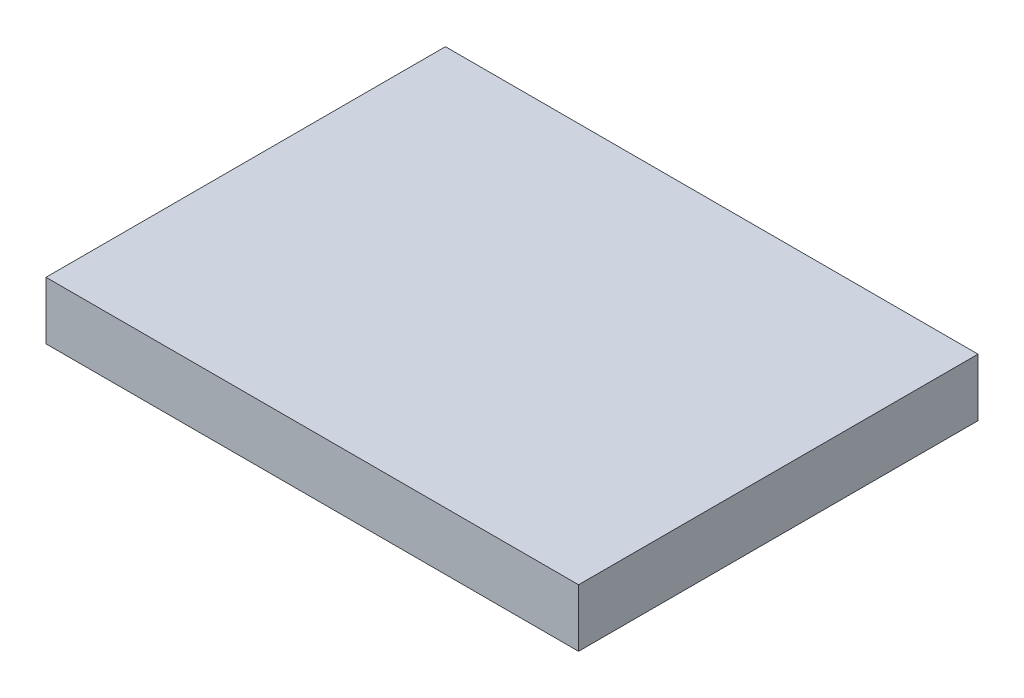
ISO-10303-21;
HEADER;
FILE_DESCRIPTION(('STEP AP214'),'2;1');
FILE_NAME('part.step','',(''),(''),'','','');
FILE_SCHEMA(('AUTOMOTIVE_DESIGN { 1 0 10303 214 1 1 1 1 }'));
ENDSEC;
DATA;
#1=APPLICATION_CONTEXT('core data for automotive mechanical design processes');
#2=APPLICATION_PROTOCOL_DEFINITION('international standard','automotive_design',2000,#1);
#3=PRODUCT_CONTEXT('',#1,'mechanical');
#4=PRODUCT('Part','Part','',(#3));
#5=PRODUCT_RELATED_PRODUCT_CATEGORY('part','',(#4));
#6=PRODUCT_DEFINITION_FORMATION('','',#4);
#7=PRODUCT_DEFINITION_CONTEXT('part definition',#1,'design');
#8=PRODUCT_DEFINITION('design','',#6,#7);
#9=PRODUCT_DEFINITION_SHAPE('','',#8);
#10=(LENGTH_UNIT() NAMED_UNIT(*) SI_UNIT(.MILLI.,.METRE.));
#11=(NAMED_UNIT(*) PLANE_ANGLE_UNIT() SI_UNIT($,.RADIAN.));
#12=(NAMED_UNIT(*) SI_UNIT($,.STERADIAN.) SOLID_ANGLE_UNIT());
#13=UNCERTAINTY_MEASURE_WITH_UNIT(LENGTH_MEASURE(1.E-05),#10,'distance_accuracy_value','');
#14=(GEOMETRIC_REPRESENTATION_CONTEXT(3) GLOBAL_UNCERTAINTY_ASSIGNED_CONTEXT((#13)) GLOBAL_UNIT_ASSIGNED_CONTEXT((#10,
#11,#12)) REPRESENTATION_CONTEXT('',''));
#15=CARTESIAN_POINT('',(0.,0.,0.));
#16=DIRECTION('',(0.,0.,1.));
#17=DIRECTION('',(1.,0.,0.));
#18=AXIS2_PLACEMENT_3D('',#15,#16,#17);
#19=CARTESIAN_POINT('',(0.,4.4,0.));
#20=DIRECTION('',(1.,0.,0.));
#21=DIRECTION('',(0.,0.,-1.));
#22=AXIS2_PLACEMENT_3D('',#19,#20,#21);
#23=PLANE('',#22);
#24=DIRECTION('',(0.,0.,1.));
#25=VECTOR('',#24,1.);
#26=CARTESIAN_POINT('',(0.,0.,0.));
#27=LINE('',#26,#25);
#28=CARTESIAN_POINT('',(0.,0.,-30.48));
#29=VERTEX_POINT('',#28);
#30=CARTESIAN_POINT('',(0.,0.,0.));
#31=VERTEX_POINT('',#30);
#32=EDGE_CURVE('E96',#29,#31,#27,.T.);
#33=ORIENTED_EDGE('',*,*,#32,.T.);
#34=DIRECTION('',(0.,-1.,0.));
#35=VECTOR('',#34,1.);
#36=CARTESIAN_POINT('',(0.,4.4,0.));
#37=LINE('',#36,#35);
#38=CARTESIAN_POINT('',(0.,4.4,0.));
#39=VERTEX_POINT('',#38);
#40=EDGE_CURVE('E11',#39,#31,#37,.T.);
#41=ORIENTED_EDGE('',*,*,#40,.F.);
#42=DIRECTION('',(0.,0.,1.));
#43=VECTOR('',#42,1.);
#44=CARTESIAN_POINT('',(0.,4.4,0.));
#45=LINE('',#44,#43);
#46=CARTESIAN_POINT('',(0.,4.4,-30.48));
#47=VERTEX_POINT('',#46);
#48=EDGE_CURVE('E84',#47,#39,#45,.T.);
#49=ORIENTED_EDGE('',*,*,#48,.F.);
#50=DIRECTION('',(0.,-1.,0.));
#51=VECTOR('',#50,1.);
#52=CARTESIAN_POINT('',(0.,4.4,-30.48));
#53=LINE('',#52,#51);
#54=EDGE_CURVE('E92',#47,#29,#53,.T.);
#55=ORIENTED_EDGE('',*,*,#54,.T.);
#56=EDGE_LOOP('',(#33,#41,#49,#55));
#57=FACE_BOUND('',#56,.T.);
#58=ADVANCED_FACE('F33',(#57),#23,.F.);
#59=CARTESIAN_POINT('',(0.,4.4,0.));
#60=DIRECTION('',(0.,0.,-1.));
#61=DIRECTION('',(-1.,0.,0.));
#62=AXIS2_PLACEMENT_3D('',#59,#60,#61);
#63=PLANE('',#62);
#64=DIRECTION('',(1.,0.,0.));
#65=VECTOR('',#64,1.);
#66=CARTESIAN_POINT('',(0.,0.,0.));
#67=LINE('',#66,#65);
#68=CARTESIAN_POINT('',(40.64,0.,0.));
#69=VERTEX_POINT('',#68);
#70=EDGE_CURVE('E88',#31,#69,#67,.T.);
#71=ORIENTED_EDGE('',*,*,#70,.T.);
#72=DIRECTION('',(0.,-1.,0.));
#73=VECTOR('',#72,1.);
#74=CARTESIAN_POINT('',(40.64,4.4,0.));
#75=LINE('',#74,#73);
#76=CARTESIAN_POINT('',(40.64,4.4,0.));
#77=VERTEX_POINT('',#76);
#78=EDGE_CURVE('E41',#77,#69,#75,.T.);
#79=ORIENTED_EDGE('',*,*,#78,.F.);
#80=DIRECTION('',(1.,0.,0.));
#81=VECTOR('',#80,1.);
#82=CARTESIAN_POINT('',(0.,4.4,0.));
#83=LINE('',#82,#81);
#84=EDGE_CURVE('E79',#39,#77,#83,.T.);
#85=ORIENTED_EDGE('',*,*,#84,.F.);
#86=ORIENTED_EDGE('',*,*,#40,.T.);
#87=EDGE_LOOP('',(#71,#79,#85,#86));
#88=FACE_BOUND('',#87,.T.);
#89=ADVANCED_FACE('F87',(#88),#63,.F.);
#90=CARTESIAN_POINT('',(40.64,4.4,0.));
#91=DIRECTION('',(-1.,0.,0.));
#92=DIRECTION('',(0.,0.,1.));
#93=AXIS2_PLACEMENT_3D('',#90,#91,#92);
#94=PLANE('',#93);
#95=DIRECTION('',(0.,0.,-1.));
#96=VECTOR('',#95,1.);
#97=CARTESIAN_POINT('',(40.64,0.,0.));
#98=LINE('',#97,#96);
#99=CARTESIAN_POINT('',(40.64,0.,-30.48));
#100=VERTEX_POINT('',#99);
#101=EDGE_CURVE('E66',#69,#100,#98,.T.);
#102=ORIENTED_EDGE('',*,*,#101,.T.);
#103=DIRECTION('',(0.,-1.,0.));
#104=VECTOR('',#103,1.);
#105=CARTESIAN_POINT('',(40.64,4.4,-30.48));
#106=LINE('',#105,#104);
#107=CARTESIAN_POINT('',(40.64,4.4,-30.48));
#108=VERTEX_POINT('',#107);
#109=EDGE_CURVE('E89',#108,#100,#106,.T.);
#110=ORIENTED_EDGE('',*,*,#109,.F.);
#111=DIRECTION('',(0.,0.,-1.));
#112=VECTOR('',#111,1.);
#113=CARTESIAN_POINT('',(40.64,4.4,0.));
#114=LINE('',#113,#112);
#115=EDGE_CURVE('E82',#77,#108,#114,.T.);
#116=ORIENTED_EDGE('',*,*,#115,.F.);
#117=ORIENTED_EDGE('',*,*,#78,.T.);
#118=EDGE_LOOP('',(#102,#110,#116,#117));
#119=FACE_BOUND('',#118,.T.);
#120=ADVANCED_FACE('F90',(#119),#94,.F.);
#121=CARTESIAN_POINT('',(0.,4.4,-30.48));
#122=DIRECTION('',(0.,0.,1.));
#123=DIRECTION('',(1.,0.,0.));
#124=AXIS2_PLACEMENT_3D('',#121,#122,#123);
#125=PLANE('',#124);
#126=DIRECTION('',(-1.,0.,0.));
#127=VECTOR('',#126,1.);
#128=CARTESIAN_POINT('',(0.,0.,-30.48));
#129=LINE('',#128,#127);
#130=EDGE_CURVE('E72',#100,#29,#129,.T.);
#131=ORIENTED_EDGE('',*,*,#130,.T.);
#132=ORIENTED_EDGE('',*,*,#54,.F.);
#133=DIRECTION('',(-1.,0.,0.));
#134=VECTOR('',#133,1.);
#135=CARTESIAN_POINT('',(0.,4.4,-30.48));
#136=LINE('',#135,#134);
#137=EDGE_CURVE('E49',#108,#47,#136,.T.);
#138=ORIENTED_EDGE('',*,*,#137,.F.);
#139=ORIENTED_EDGE('',*,*,#109,.T.);
#140=EDGE_LOOP('',(#131,#132,#138,#139));
#141=FACE_BOUND('',#140,.T.);
#142=ADVANCED_FACE('F103',(#141),#125,.F.);
#143=CARTESIAN_POINT('',(0.,4.4,0.));
#144=DIRECTION('',(0.,-1.,0.));
#145=DIRECTION('',(0.,0.,-1.));
#146=AXIS2_PLACEMENT_3D('',#143,#144,#145);
#147=PLANE('',#146);
#148=ORIENTED_EDGE('',*,*,#48,.T.);
#149=ORIENTED_EDGE('',*,*,#84,.T.);
#150=ORIENTED_EDGE('',*,*,#115,.T.);
#151=ORIENTED_EDGE('',*,*,#137,.T.);
#152=EDGE_LOOP('',(#148,#149,#150,#151));
#153=FACE_BOUND('',#152,.T.);
#154=ADVANCED_FACE('F80',(#153),#147,.F.);
#155=CARTESIAN_POINT('',(0.,0.,0.));
#156=DIRECTION('',(0.,-1.,0.));
#157=DIRECTION('',(0.,0.,-1.));
#158=AXIS2_PLACEMENT_3D('',#155,#156,#157);
#159=PLANE('',#158);
#160=ORIENTED_EDGE('',*,*,#32,.F.);
#161=ORIENTED_EDGE('',*,*,#130,.F.);
#162=ORIENTED_EDGE('',*,*,#101,.F.);
#163=ORIENTED_EDGE('',*,*,#70,.F.);
#164=EDGE_LOOP('',(#160,#161,#162,#163));
#165=FACE_BOUND('',#164,.T.);
#166=ADVANCED_FACE('F106',(#165),#159,.T.);
#167=CLOSED_SHELL('',(#58,#89,#120,#142,#154,#166));
#168=MANIFOLD_SOLID_BREP('B2',#167);
#169=ADVANCED_BREP_SHAPE_REPRESENTATION('',(#18,#168),#14);
#170=SHAPE_DEFINITION_REPRESENTATION(#9,#169);
ENDSEC;
END-ISO-10303-21;
